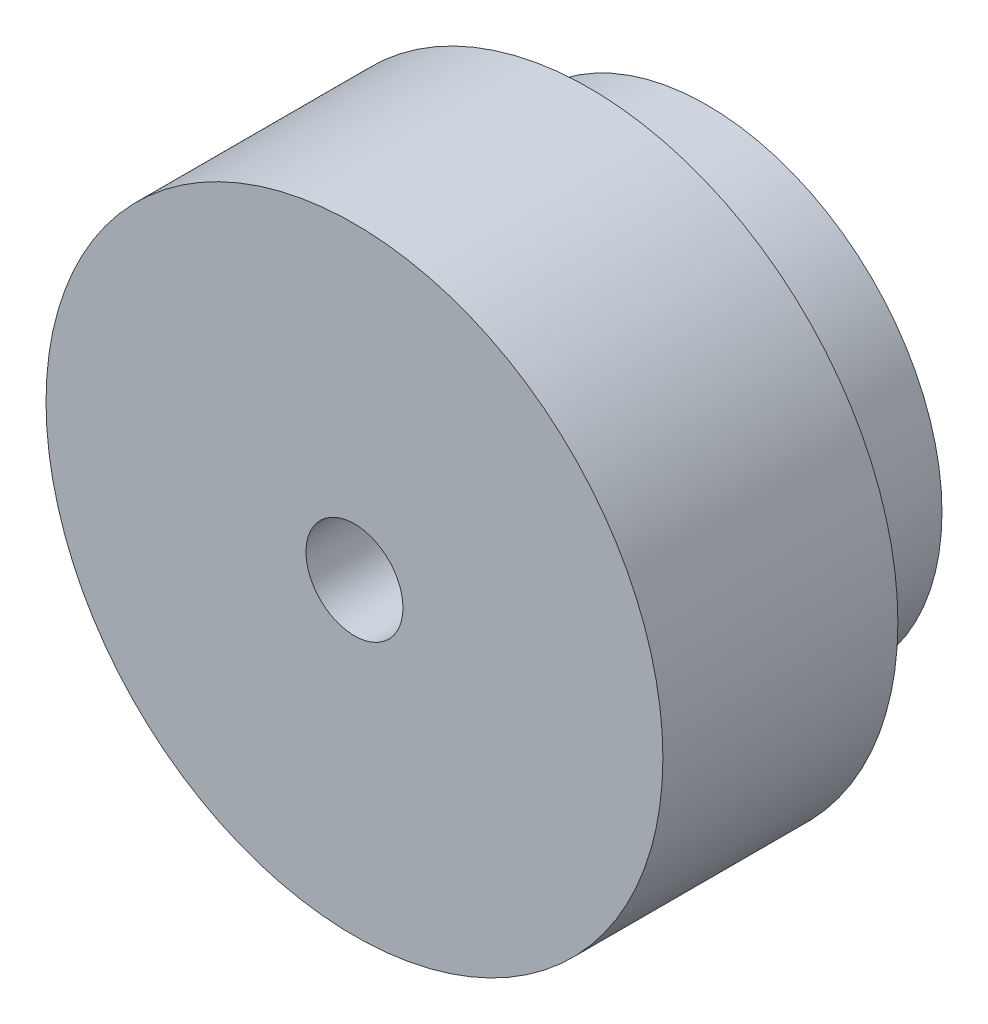
ISO-10303-21;
HEADER;
FILE_DESCRIPTION(('STEP AP214'),'2;1');
FILE_NAME('part.step','',(''),(''),'','','');
FILE_SCHEMA(('AUTOMOTIVE_DESIGN { 1 0 10303 214 1 1 1 1 }'));
ENDSEC;
DATA;
#1=APPLICATION_CONTEXT('core data for automotive mechanical design processes');
#2=APPLICATION_PROTOCOL_DEFINITION('international standard','automotive_design',2000,#1);
#3=PRODUCT_CONTEXT('',#1,'mechanical');
#4=PRODUCT('Part','Part','',(#3));
#5=PRODUCT_RELATED_PRODUCT_CATEGORY('part','',(#4));
#6=PRODUCT_DEFINITION_FORMATION('','',#4);
#7=PRODUCT_DEFINITION_CONTEXT('part definition',#1,'design');
#8=PRODUCT_DEFINITION('design','',#6,#7);
#9=PRODUCT_DEFINITION_SHAPE('','',#8);
#10=(LENGTH_UNIT() NAMED_UNIT(*) SI_UNIT(.MILLI.,.METRE.));
#11=(NAMED_UNIT(*) PLANE_ANGLE_UNIT() SI_UNIT($,.RADIAN.));
#12=(NAMED_UNIT(*) SI_UNIT($,.STERADIAN.) SOLID_ANGLE_UNIT());
#13=UNCERTAINTY_MEASURE_WITH_UNIT(LENGTH_MEASURE(1.E-05),#10,'distance_accuracy_value','');
#14=(GEOMETRIC_REPRESENTATION_CONTEXT(3) GLOBAL_UNCERTAINTY_ASSIGNED_CONTEXT((#13)) GLOBAL_UNIT_ASSIGNED_CONTEXT((#10,
#11,#12)) REPRESENTATION_CONTEXT('',''));
#15=CARTESIAN_POINT('',(0.,0.,0.));
#16=DIRECTION('',(0.,0.,1.));
#17=DIRECTION('',(1.,0.,0.));
#18=AXIS2_PLACEMENT_3D('',#15,#16,#17);
#19=CARTESIAN_POINT('',(0.,16.002,0.));
#20=DIRECTION('',(0.,0.,1.));
#21=DIRECTION('',(1.,0.,0.));
#22=AXIS2_PLACEMENT_3D('',#19,#20,#21);
#23=PLANE('',#22);
#24=CARTESIAN_POINT('',(0.,0.,0.));
#25=DIRECTION('',(0.,0.,1.));
#26=DIRECTION('',(1.,0.,0.));
#27=AXIS2_PLACEMENT_3D('',#24,#25,#26);
#28=CIRCLE('',#27,16.002);
#29=CARTESIAN_POINT('',(16.002,0.,0.));
#30=VERTEX_POINT('',#29);
#31=EDGE_CURVE('E53',#30,#30,#28,.T.);
#32=ORIENTED_EDGE('',*,*,#31,.F.);
#33=EDGE_LOOP('',(#32));
#34=FACE_BOUND('',#33,.T.);
#35=CARTESIAN_POINT('',(0.,0.,0.));
#36=DIRECTION('',(0.,0.,1.));
#37=DIRECTION('',(1.,0.,0.));
#38=AXIS2_PLACEMENT_3D('',#35,#36,#37);
#39=CIRCLE('',#38,3.302);
#40=CARTESIAN_POINT('',(3.302,0.,0.));
#41=VERTEX_POINT('',#40);
#42=EDGE_CURVE('E10',#41,#41,#39,.T.);
#43=ORIENTED_EDGE('',*,*,#42,.T.);
#44=EDGE_LOOP('',(#43));
#45=FACE_BOUND('',#44,.T.);
#46=ADVANCED_FACE('F31',(#34,#45),#23,.F.);
#47=CARTESIAN_POINT('',(0.,0.,0.));
#48=DIRECTION('',(0.,0.,1.));
#49=DIRECTION('',(1.,0.,0.));
#50=AXIS2_PLACEMENT_3D('',#47,#48,#49);
#51=CYLINDRICAL_SURFACE('',#50,3.302);
#52=ORIENTED_EDGE('',*,*,#42,.F.);
#53=EDGE_LOOP('',(#52));
#54=FACE_BOUND('',#53,.T.);
#55=CARTESIAN_POINT('',(0.,0.,24.));
#56=DIRECTION('',(0.,0.,1.));
#57=DIRECTION('',(1.,0.,0.));
#58=AXIS2_PLACEMENT_3D('',#55,#56,#57);
#59=CIRCLE('',#58,3.302);
#60=CARTESIAN_POINT('',(3.302,0.,24.));
#61=VERTEX_POINT('',#60);
#62=EDGE_CURVE('E37',#61,#61,#59,.T.);
#63=ORIENTED_EDGE('',*,*,#62,.T.);
#64=EDGE_LOOP('',(#63));
#65=FACE_BOUND('',#64,.T.);
#66=ADVANCED_FACE('F60',(#54,#65),#51,.F.);
#67=CARTESIAN_POINT('',(0.,3.302,24.));
#68=DIRECTION('',(0.,0.,-1.));
#69=DIRECTION('',(-1.,0.,0.));
#70=AXIS2_PLACEMENT_3D('',#67,#68,#69);
#71=PLANE('',#70);
#72=ORIENTED_EDGE('',*,*,#62,.F.);
#73=EDGE_LOOP('',(#72));
#74=FACE_BOUND('',#73,.T.);
#75=CARTESIAN_POINT('',(0.,0.,24.));
#76=DIRECTION('',(0.,0.,1.));
#77=DIRECTION('',(1.,0.,0.));
#78=AXIS2_PLACEMENT_3D('',#75,#76,#77);
#79=CIRCLE('',#78,21.);
#80=CARTESIAN_POINT('',(21.,0.,24.));
#81=VERTEX_POINT('',#80);
#82=EDGE_CURVE('E41',#81,#81,#79,.T.);
#83=ORIENTED_EDGE('',*,*,#82,.T.);
#84=EDGE_LOOP('',(#83));
#85=FACE_BOUND('',#84,.T.);
#86=ADVANCED_FACE('F64',(#74,#85),#71,.F.);
#87=CARTESIAN_POINT('',(0.,0.,0.));
#88=DIRECTION('',(0.,0.,1.));
#89=DIRECTION('',(1.,0.,0.));
#90=AXIS2_PLACEMENT_3D('',#87,#88,#89);
#91=CYLINDRICAL_SURFACE('',#90,21.);
#92=ORIENTED_EDGE('',*,*,#82,.F.);
#93=EDGE_LOOP('',(#92));
#94=FACE_BOUND('',#93,.T.);
#95=CARTESIAN_POINT('',(0.,0.,8.));
#96=DIRECTION('',(0.,0.,1.));
#97=DIRECTION('',(1.,0.,0.));
#98=AXIS2_PLACEMENT_3D('',#95,#96,#97);
#99=CIRCLE('',#98,21.);
#100=CARTESIAN_POINT('',(21.,0.,8.));
#101=VERTEX_POINT('',#100);
#102=EDGE_CURVE('E45',#101,#101,#99,.T.);
#103=ORIENTED_EDGE('',*,*,#102,.T.);
#104=EDGE_LOOP('',(#103));
#105=FACE_BOUND('',#104,.T.);
#106=ADVANCED_FACE('F69',(#94,#105),#91,.T.);
#107=CARTESIAN_POINT('',(0.,21.,8.));
#108=DIRECTION('',(0.,0.,1.));
#109=DIRECTION('',(1.,0.,0.));
#110=AXIS2_PLACEMENT_3D('',#107,#108,#109);
#111=PLANE('',#110);
#112=ORIENTED_EDGE('',*,*,#102,.F.);
#113=EDGE_LOOP('',(#112));
#114=FACE_BOUND('',#113,.T.);
#115=CARTESIAN_POINT('',(0.,0.,8.));
#116=DIRECTION('',(0.,0.,1.));
#117=DIRECTION('',(1.,0.,0.));
#118=AXIS2_PLACEMENT_3D('',#115,#116,#117);
#119=CIRCLE('',#118,16.002);
#120=CARTESIAN_POINT('',(16.002,0.,8.));
#121=VERTEX_POINT('',#120);
#122=EDGE_CURVE('E50',#121,#121,#119,.T.);
#123=ORIENTED_EDGE('',*,*,#122,.T.);
#124=EDGE_LOOP('',(#123));
#125=FACE_BOUND('',#124,.T.);
#126=ADVANCED_FACE('F75',(#114,#125),#111,.F.);
#127=CARTESIAN_POINT('',(0.,0.,0.));
#128=DIRECTION('',(0.,0.,1.));
#129=DIRECTION('',(1.,0.,0.));
#130=AXIS2_PLACEMENT_3D('',#127,#128,#129);
#131=CYLINDRICAL_SURFACE('',#130,16.002);
#132=ORIENTED_EDGE('',*,*,#122,.F.);
#133=EDGE_LOOP('',(#132));
#134=FACE_BOUND('',#133,.T.);
#135=ORIENTED_EDGE('',*,*,#31,.T.);
#136=EDGE_LOOP('',(#135));
#137=FACE_BOUND('',#136,.T.);
#138=ADVANCED_FACE('F57',(#134,#137),#131,.T.);
#139=CLOSED_SHELL('',(#46,#66,#86,#106,#126,#138));
#140=MANIFOLD_SOLID_BREP('B2',#139);
#141=ADVANCED_BREP_SHAPE_REPRESENTATION('',(#18,#140),#14);
#142=SHAPE_DEFINITION_REPRESENTATION(#9,#141);
ENDSEC;
END-ISO-10303-21;
